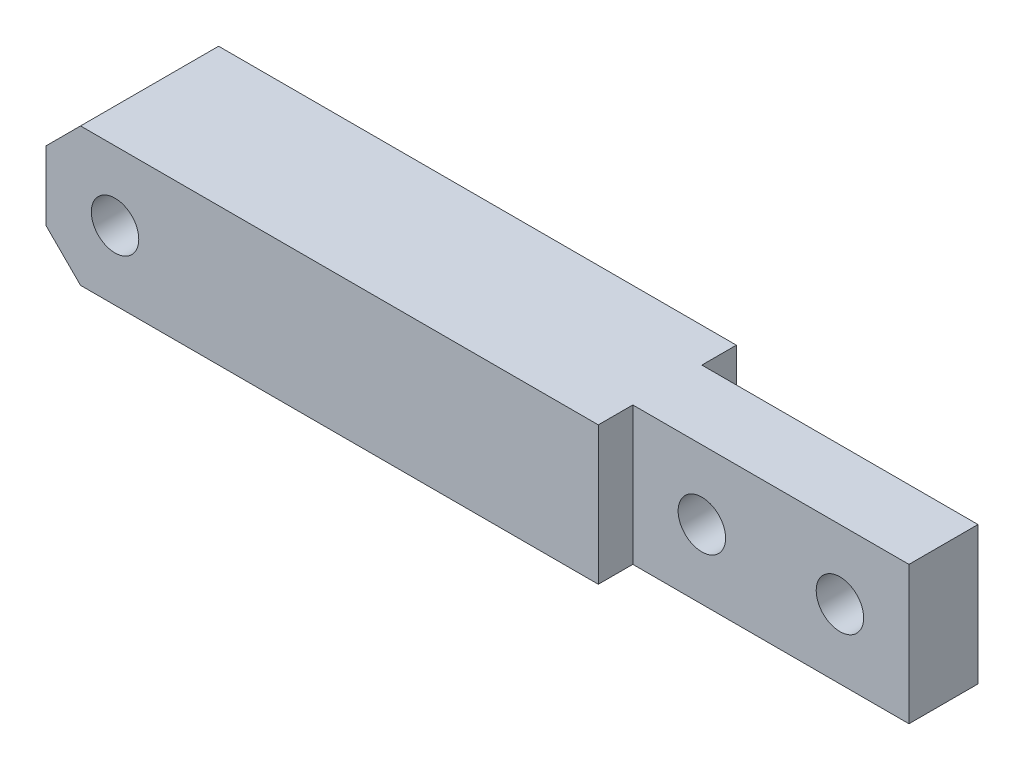
ISO-10303-21;
HEADER;
FILE_DESCRIPTION(('STEP AP214'),'2;1');
FILE_NAME('part.step','',(''),(''),'','','');
FILE_SCHEMA(('AUTOMOTIVE_DESIGN { 1 0 10303 214 1 1 1 1 }'));
ENDSEC;
DATA;
#1=APPLICATION_CONTEXT('core data for automotive mechanical design processes');
#2=APPLICATION_PROTOCOL_DEFINITION('international standard','automotive_design',2000,#1);
#3=PRODUCT_CONTEXT('',#1,'mechanical');
#4=PRODUCT('Part','Part','',(#3));
#5=PRODUCT_RELATED_PRODUCT_CATEGORY('part','',(#4));
#6=PRODUCT_DEFINITION_FORMATION('','',#4);
#7=PRODUCT_DEFINITION_CONTEXT('part definition',#1,'design');
#8=PRODUCT_DEFINITION('design','',#6,#7);
#9=PRODUCT_DEFINITION_SHAPE('','',#8);
#10=(LENGTH_UNIT() NAMED_UNIT(*) SI_UNIT(.MILLI.,.METRE.));
#11=(NAMED_UNIT(*) PLANE_ANGLE_UNIT() SI_UNIT($,.RADIAN.));
#12=(NAMED_UNIT(*) SI_UNIT($,.STERADIAN.) SOLID_ANGLE_UNIT());
#13=UNCERTAINTY_MEASURE_WITH_UNIT(LENGTH_MEASURE(1.E-05),#10,'distance_accuracy_value','');
#14=(GEOMETRIC_REPRESENTATION_CONTEXT(3) GLOBAL_UNCERTAINTY_ASSIGNED_CONTEXT((#13)) GLOBAL_UNIT_ASSIGNED_CONTEXT((#10,
#11,#12)) REPRESENTATION_CONTEXT('',''));
#15=CARTESIAN_POINT('',(0.,0.,0.));
#16=DIRECTION('',(0.,0.,1.));
#17=DIRECTION('',(1.,0.,0.));
#18=AXIS2_PLACEMENT_3D('',#15,#16,#17);
#19=CARTESIAN_POINT('',(0.,6.35,-12.7));
#20=DIRECTION('',(1.,0.,0.));
#21=DIRECTION('',(0.,0.,-1.));
#22=AXIS2_PLACEMENT_3D('',#19,#20,#21);
#23=PLANE('',#22);
#24=DIRECTION('',(0.,-1.,0.));
#25=VECTOR('',#24,1.);
#26=CARTESIAN_POINT('',(0.,6.35,-12.7));
#27=LINE('',#26,#25);
#28=CARTESIAN_POINT('',(0.,3.17499999999999,-12.7));
#29=VERTEX_POINT('',#28);
#30=CARTESIAN_POINT('',(0.,-3.175,-12.7));
#31=VERTEX_POINT('',#30);
#32=EDGE_CURVE('E167',#29,#31,#27,.T.);
#33=ORIENTED_EDGE('',*,*,#32,.T.);
#34=DIRECTION('',(0.,0.,1.));
#35=VECTOR('',#34,1.);
#36=CARTESIAN_POINT('',(0.,-3.175,-12.7));
#37=LINE('',#36,#35);
#38=CARTESIAN_POINT('',(0.,-3.175,0.));
#39=VERTEX_POINT('',#38);
#40=EDGE_CURVE('E224',#31,#39,#37,.T.);
#41=ORIENTED_EDGE('',*,*,#40,.T.);
#42=DIRECTION('',(0.,-1.,0.));
#43=VECTOR('',#42,1.);
#44=CARTESIAN_POINT('',(0.,6.35,0.));
#45=LINE('',#44,#43);
#46=CARTESIAN_POINT('',(0.,3.17499999999999,0.));
#47=VERTEX_POINT('',#46);
#48=EDGE_CURVE('E142',#47,#39,#45,.T.);
#49=ORIENTED_EDGE('',*,*,#48,.F.);
#50=DIRECTION('',(0.,0.,-1.));
#51=VECTOR('',#50,1.);
#52=CARTESIAN_POINT('',(0.,3.17499999999999,-12.7));
#53=LINE('',#52,#51);
#54=EDGE_CURVE('E211',#47,#29,#53,.T.);
#55=ORIENTED_EDGE('',*,*,#54,.T.);
#56=EDGE_LOOP('',(#33,#41,#49,#55));
#57=FACE_BOUND('',#56,.T.);
#58=ADVANCED_FACE('F41',(#57),#23,.F.);
#59=CARTESIAN_POINT('',(0.,6.35,0.));
#60=DIRECTION('',(0.,0.,-1.));
#61=DIRECTION('',(-1.,0.,0.));
#62=AXIS2_PLACEMENT_3D('',#59,#60,#61);
#63=PLANE('',#62);
#64=CARTESIAN_POINT('',(6.35,0.,0.));
#65=DIRECTION('',(0.,0.,-1.));
#66=DIRECTION('',(-1.,0.,0.));
#67=AXIS2_PLACEMENT_3D('',#64,#65,#66);
#68=CIRCLE('',#67,2.1828125);
#69=CARTESIAN_POINT('',(4.1671875,0.,0.));
#70=VERTEX_POINT('',#69);
#71=EDGE_CURVE('E217',#70,#70,#68,.T.);
#72=ORIENTED_EDGE('',*,*,#71,.T.);
#73=EDGE_LOOP('',(#72));
#74=FACE_BOUND('',#73,.T.);
#75=ORIENTED_EDGE('',*,*,#48,.T.);
#76=DIRECTION('',(-0.707106781186549,0.707106781186546,0.));
#77=VECTOR('',#76,1.);
#78=CARTESIAN_POINT('',(0.,-3.175,0.));
#79=LINE('',#78,#77);
#80=CARTESIAN_POINT('',(3.17500000000002,-6.35,0.));
#81=VERTEX_POINT('',#80);
#82=EDGE_CURVE('E231',#39,#81,#79,.F.);
#83=ORIENTED_EDGE('',*,*,#82,.T.);
#84=DIRECTION('',(1.,0.,0.));
#85=VECTOR('',#84,1.);
#86=CARTESIAN_POINT('',(0.,-6.35,0.));
#87=LINE('',#86,#85);
#88=CARTESIAN_POINT('',(50.8,-6.35,0.));
#89=VERTEX_POINT('',#88);
#90=EDGE_CURVE('E138',#81,#89,#87,.T.);
#91=ORIENTED_EDGE('',*,*,#90,.T.);
#92=DIRECTION('',(0.,-1.,0.));
#93=VECTOR('',#92,1.);
#94=CARTESIAN_POINT('',(50.8,6.35,0.));
#95=LINE('',#94,#93);
#96=CARTESIAN_POINT('',(50.8,6.35,0.));
#97=VERTEX_POINT('',#96);
#98=EDGE_CURVE('E135',#97,#89,#95,.T.);
#99=ORIENTED_EDGE('',*,*,#98,.F.);
#100=DIRECTION('',(1.,0.,0.));
#101=VECTOR('',#100,1.);
#102=CARTESIAN_POINT('',(0.,6.35,0.));
#103=LINE('',#102,#101);
#104=CARTESIAN_POINT('',(3.175,6.35,0.));
#105=VERTEX_POINT('',#104);
#106=EDGE_CURVE('E123',#105,#97,#103,.T.);
#107=ORIENTED_EDGE('',*,*,#106,.F.);
#108=DIRECTION('',(-0.707106781186547,-0.707106781186548,0.));
#109=VECTOR('',#108,1.);
#110=CARTESIAN_POINT('',(3.175,6.35,0.));
#111=LINE('',#110,#109);
#112=EDGE_CURVE('E228',#105,#47,#111,.T.);
#113=ORIENTED_EDGE('',*,*,#112,.T.);
#114=EDGE_LOOP('',(#75,#83,#91,#99,#107,#113));
#115=FACE_BOUND('',#114,.T.);
#116=ADVANCED_FACE('F137',(#74,#115),#63,.F.);
#117=CARTESIAN_POINT('',(50.8,6.35,0.));
#118=DIRECTION('',(-1.,0.,0.));
#119=DIRECTION('',(0.,0.,1.));
#120=AXIS2_PLACEMENT_3D('',#117,#118,#119);
#121=PLANE('',#120);
#122=DIRECTION('',(0.,0.,-1.));
#123=VECTOR('',#122,1.);
#124=CARTESIAN_POINT('',(50.8,-6.35,0.));
#125=LINE('',#124,#123);
#126=CARTESIAN_POINT('',(50.8,-6.35,-3.175));
#127=VERTEX_POINT('',#126);
#128=EDGE_CURVE('E170',#89,#127,#125,.T.);
#129=ORIENTED_EDGE('',*,*,#128,.T.);
#130=DIRECTION('',(0.,-1.,0.));
#131=VECTOR('',#130,1.);
#132=CARTESIAN_POINT('',(50.8,6.35,-3.175));
#133=LINE('',#132,#131);
#134=CARTESIAN_POINT('',(50.8,6.35,-3.175));
#135=VERTEX_POINT('',#134);
#136=EDGE_CURVE('E143',#135,#127,#133,.T.);
#137=ORIENTED_EDGE('',*,*,#136,.F.);
#138=DIRECTION('',(0.,0.,-1.));
#139=VECTOR('',#138,1.);
#140=CARTESIAN_POINT('',(50.8,6.35,0.));
#141=LINE('',#140,#139);
#142=EDGE_CURVE('E127',#97,#135,#141,.T.);
#143=ORIENTED_EDGE('',*,*,#142,.F.);
#144=ORIENTED_EDGE('',*,*,#98,.T.);
#145=EDGE_LOOP('',(#129,#137,#143,#144));
#146=FACE_BOUND('',#145,.T.);
#147=ADVANCED_FACE('F145',(#146),#121,.F.);
#148=CARTESIAN_POINT('',(50.8,6.35,-3.175));
#149=DIRECTION('',(0.,0.,-1.));
#150=DIRECTION('',(-1.,0.,0.));
#151=AXIS2_PLACEMENT_3D('',#148,#149,#150);
#152=PLANE('',#151);
#153=CARTESIAN_POINT('',(57.15,0.,-3.175));
#154=DIRECTION('',(0.,0.,-1.));
#155=DIRECTION('',(-1.,0.,0.));
#156=AXIS2_PLACEMENT_3D('',#153,#154,#155);
#157=CIRCLE('',#156,2.1828125);
#158=CARTESIAN_POINT('',(54.9671875,0.,-3.175));
#159=VERTEX_POINT('',#158);
#160=EDGE_CURVE('E171',#159,#159,#157,.T.);
#161=ORIENTED_EDGE('',*,*,#160,.T.);
#162=EDGE_LOOP('',(#161));
#163=FACE_BOUND('',#162,.T.);
#164=CARTESIAN_POINT('',(69.85,0.,-3.175));
#165=DIRECTION('',(0.,0.,-1.));
#166=DIRECTION('',(-1.,0.,0.));
#167=AXIS2_PLACEMENT_3D('',#164,#165,#166);
#168=CIRCLE('',#167,2.1828125);
#169=CARTESIAN_POINT('',(67.6671875,0.,-3.175));
#170=VERTEX_POINT('',#169);
#171=EDGE_CURVE('E216',#170,#170,#168,.T.);
#172=ORIENTED_EDGE('',*,*,#171,.T.);
#173=EDGE_LOOP('',(#172));
#174=FACE_BOUND('',#173,.T.);
#175=DIRECTION('',(1.,0.,0.));
#176=VECTOR('',#175,1.);
#177=CARTESIAN_POINT('',(50.8,-6.35,-3.175));
#178=LINE('',#177,#176);
#179=CARTESIAN_POINT('',(76.2,-6.35,-3.175));
#180=VERTEX_POINT('',#179);
#181=EDGE_CURVE('E174',#127,#180,#178,.T.);
#182=ORIENTED_EDGE('',*,*,#181,.T.);
#183=DIRECTION('',(0.,-1.,0.));
#184=VECTOR('',#183,1.);
#185=CARTESIAN_POINT('',(76.2,6.35,-3.175));
#186=LINE('',#185,#184);
#187=CARTESIAN_POINT('',(76.2,6.35,-3.175));
#188=VERTEX_POINT('',#187);
#189=EDGE_CURVE('E203',#188,#180,#186,.T.);
#190=ORIENTED_EDGE('',*,*,#189,.F.);
#191=DIRECTION('',(1.,0.,0.));
#192=VECTOR('',#191,1.);
#193=CARTESIAN_POINT('',(50.8,6.35,-3.175));
#194=LINE('',#193,#192);
#195=EDGE_CURVE('E149',#135,#188,#194,.T.);
#196=ORIENTED_EDGE('',*,*,#195,.F.);
#197=ORIENTED_EDGE('',*,*,#136,.T.);
#198=EDGE_LOOP('',(#182,#190,#196,#197));
#199=FACE_BOUND('',#198,.T.);
#200=ADVANCED_FACE('F250',(#163,#174,#199),#152,.F.);
#201=CARTESIAN_POINT('',(76.2,6.35,-3.175));
#202=DIRECTION('',(-1.,0.,0.));
#203=DIRECTION('',(0.,0.,1.));
#204=AXIS2_PLACEMENT_3D('',#201,#202,#203);
#205=PLANE('',#204);
#206=DIRECTION('',(0.,0.,-1.));
#207=VECTOR('',#206,1.);
#208=CARTESIAN_POINT('',(76.2,-6.35,-3.175));
#209=LINE('',#208,#207);
#210=CARTESIAN_POINT('',(76.2,-6.35,-9.525));
#211=VERTEX_POINT('',#210);
#212=EDGE_CURVE('E177',#180,#211,#209,.T.);
#213=ORIENTED_EDGE('',*,*,#212,.T.);
#214=DIRECTION('',(0.,-1.,0.));
#215=VECTOR('',#214,1.);
#216=CARTESIAN_POINT('',(76.2,6.35,-9.525));
#217=LINE('',#216,#215);
#218=CARTESIAN_POINT('',(76.2,6.35,-9.525));
#219=VERTEX_POINT('',#218);
#220=EDGE_CURVE('E199',#219,#211,#217,.T.);
#221=ORIENTED_EDGE('',*,*,#220,.F.);
#222=DIRECTION('',(0.,0.,-1.));
#223=VECTOR('',#222,1.);
#224=CARTESIAN_POINT('',(76.2,6.35,-3.175));
#225=LINE('',#224,#223);
#226=EDGE_CURVE('E152',#188,#219,#225,.T.);
#227=ORIENTED_EDGE('',*,*,#226,.F.);
#228=ORIENTED_EDGE('',*,*,#189,.T.);
#229=EDGE_LOOP('',(#213,#221,#227,#228));
#230=FACE_BOUND('',#229,.T.);
#231=ADVANCED_FACE('F257',(#230),#205,.F.);
#232=CARTESIAN_POINT('',(76.2,6.35,-9.525));
#233=DIRECTION('',(0.,0.,1.));
#234=DIRECTION('',(1.,0.,0.));
#235=AXIS2_PLACEMENT_3D('',#232,#233,#234);
#236=PLANE('',#235);
#237=CARTESIAN_POINT('',(57.15,0.,-9.525));
#238=DIRECTION('',(0.,0.,1.));
#239=DIRECTION('',(1.,0.,0.));
#240=AXIS2_PLACEMENT_3D('',#237,#238,#239);
#241=CIRCLE('',#240,2.1828125);
#242=CARTESIAN_POINT('',(59.3328125,0.,-9.525));
#243=VERTEX_POINT('',#242);
#244=EDGE_CURVE('E218',#243,#243,#241,.T.);
#245=ORIENTED_EDGE('',*,*,#244,.T.);
#246=EDGE_LOOP('',(#245));
#247=FACE_BOUND('',#246,.T.);
#248=CARTESIAN_POINT('',(69.85,0.,-9.525));
#249=DIRECTION('',(0.,0.,1.));
#250=DIRECTION('',(1.,0.,0.));
#251=AXIS2_PLACEMENT_3D('',#248,#249,#250);
#252=CIRCLE('',#251,2.1828125);
#253=CARTESIAN_POINT('',(72.0328125,0.,-9.525));
#254=VERTEX_POINT('',#253);
#255=EDGE_CURVE('E212',#254,#254,#252,.T.);
#256=ORIENTED_EDGE('',*,*,#255,.T.);
#257=EDGE_LOOP('',(#256));
#258=FACE_BOUND('',#257,.T.);
#259=DIRECTION('',(-1.,0.,0.));
#260=VECTOR('',#259,1.);
#261=CARTESIAN_POINT('',(76.2,-6.35,-9.525));
#262=LINE('',#261,#260);
#263=CARTESIAN_POINT('',(50.8,-6.35,-9.52499999999999));
#264=VERTEX_POINT('',#263);
#265=EDGE_CURVE('E180',#211,#264,#262,.T.);
#266=ORIENTED_EDGE('',*,*,#265,.T.);
#267=DIRECTION('',(0.,-1.,0.));
#268=VECTOR('',#267,1.);
#269=CARTESIAN_POINT('',(50.8,6.35,-9.52499999999999));
#270=LINE('',#269,#268);
#271=CARTESIAN_POINT('',(50.8,6.35,-9.52499999999999));
#272=VERTEX_POINT('',#271);
#273=EDGE_CURVE('E195',#272,#264,#270,.T.);
#274=ORIENTED_EDGE('',*,*,#273,.F.);
#275=DIRECTION('',(-1.,0.,0.));
#276=VECTOR('',#275,1.);
#277=CARTESIAN_POINT('',(76.2,6.35,-9.525));
#278=LINE('',#277,#276);
#279=EDGE_CURVE('E158',#219,#272,#278,.T.);
#280=ORIENTED_EDGE('',*,*,#279,.F.);
#281=ORIENTED_EDGE('',*,*,#220,.T.);
#282=EDGE_LOOP('',(#266,#274,#280,#281));
#283=FACE_BOUND('',#282,.T.);
#284=ADVANCED_FACE('F260',(#247,#258,#283),#236,.F.);
#285=CARTESIAN_POINT('',(50.8,6.35,-9.52499999999999));
#286=DIRECTION('',(-1.,0.,0.));
#287=DIRECTION('',(0.,0.,1.));
#288=AXIS2_PLACEMENT_3D('',#285,#286,#287);
#289=PLANE('',#288);
#290=DIRECTION('',(0.,0.,-1.));
#291=VECTOR('',#290,1.);
#292=CARTESIAN_POINT('',(50.8,-6.35,-9.52499999999999));
#293=LINE('',#292,#291);
#294=CARTESIAN_POINT('',(50.8,-6.35,-12.7));
#295=VERTEX_POINT('',#294);
#296=EDGE_CURVE('E183',#264,#295,#293,.T.);
#297=ORIENTED_EDGE('',*,*,#296,.T.);
#298=DIRECTION('',(0.,-1.,0.));
#299=VECTOR('',#298,1.);
#300=CARTESIAN_POINT('',(50.8,6.35,-12.7));
#301=LINE('',#300,#299);
#302=CARTESIAN_POINT('',(50.8,6.35,-12.7));
#303=VERTEX_POINT('',#302);
#304=EDGE_CURVE('E191',#303,#295,#301,.T.);
#305=ORIENTED_EDGE('',*,*,#304,.F.);
#306=DIRECTION('',(0.,0.,-1.));
#307=VECTOR('',#306,1.);
#308=CARTESIAN_POINT('',(50.8,6.35,-9.52499999999999));
#309=LINE('',#308,#307);
#310=EDGE_CURVE('E161',#272,#303,#309,.T.);
#311=ORIENTED_EDGE('',*,*,#310,.F.);
#312=ORIENTED_EDGE('',*,*,#273,.T.);
#313=EDGE_LOOP('',(#297,#305,#311,#312));
#314=FACE_BOUND('',#313,.T.);
#315=ADVANCED_FACE('F265',(#314),#289,.F.);
#316=CARTESIAN_POINT('',(50.8,6.35,-12.7));
#317=DIRECTION('',(0.,0.,1.));
#318=DIRECTION('',(1.,0.,0.));
#319=AXIS2_PLACEMENT_3D('',#316,#317,#318);
#320=PLANE('',#319);
#321=CARTESIAN_POINT('',(6.35,0.,-12.7));
#322=DIRECTION('',(0.,0.,1.));
#323=DIRECTION('',(1.,0.,0.));
#324=AXIS2_PLACEMENT_3D('',#321,#322,#323);
#325=CIRCLE('',#324,2.1828125);
#326=CARTESIAN_POINT('',(8.5328125,0.,-12.7));
#327=VERTEX_POINT('',#326);
#328=EDGE_CURVE('E319',#327,#327,#325,.T.);
#329=ORIENTED_EDGE('',*,*,#328,.T.);
#330=EDGE_LOOP('',(#329));
#331=FACE_BOUND('',#330,.T.);
#332=DIRECTION('',(-1.,0.,0.));
#333=VECTOR('',#332,1.);
#334=CARTESIAN_POINT('',(50.8,-6.35,-12.7));
#335=LINE('',#334,#333);
#336=CARTESIAN_POINT('',(3.17500000000003,-6.35,-12.7));
#337=VERTEX_POINT('',#336);
#338=EDGE_CURVE('E132',#295,#337,#335,.T.);
#339=ORIENTED_EDGE('',*,*,#338,.T.);
#340=DIRECTION('',(0.707106781186549,-0.707106781186546,0.));
#341=VECTOR('',#340,1.);
#342=CARTESIAN_POINT('',(0.,-3.175,-12.7));
#343=LINE('',#342,#341);
#344=EDGE_CURVE('E51',#337,#31,#343,.F.);
#345=ORIENTED_EDGE('',*,*,#344,.T.);
#346=ORIENTED_EDGE('',*,*,#32,.F.);
#347=DIRECTION('',(0.707106781186547,0.707106781186548,0.));
#348=VECTOR('',#347,1.);
#349=CARTESIAN_POINT('',(3.175,6.35,-12.7));
#350=LINE('',#349,#348);
#351=CARTESIAN_POINT('',(3.17500000000002,6.35,-12.7));
#352=VERTEX_POINT('',#351);
#353=EDGE_CURVE('E58',#29,#352,#350,.T.);
#354=ORIENTED_EDGE('',*,*,#353,.T.);
#355=DIRECTION('',(-1.,0.,0.));
#356=VECTOR('',#355,1.);
#357=CARTESIAN_POINT('',(50.8,6.35,-12.7));
#358=LINE('',#357,#356);
#359=EDGE_CURVE('E164',#303,#352,#358,.T.);
#360=ORIENTED_EDGE('',*,*,#359,.F.);
#361=ORIENTED_EDGE('',*,*,#304,.T.);
#362=EDGE_LOOP('',(#339,#345,#346,#354,#360,#361));
#363=FACE_BOUND('',#362,.T.);
#364=ADVANCED_FACE('F239',(#331,#363),#320,.F.);
#365=CARTESIAN_POINT('',(0.,6.35,0.));
#366=DIRECTION('',(0.,1.,0.));
#367=DIRECTION('',(0.,0.,1.));
#368=AXIS2_PLACEMENT_3D('',#365,#366,#367);
#369=PLANE('',#368);
#370=ORIENTED_EDGE('',*,*,#359,.T.);
#371=DIRECTION('',(0.,0.,1.));
#372=VECTOR('',#371,1.);
#373=CARTESIAN_POINT('',(3.175,6.35,0.));
#374=LINE('',#373,#372);
#375=EDGE_CURVE('E11',#352,#105,#374,.T.);
#376=ORIENTED_EDGE('',*,*,#375,.T.);
#377=ORIENTED_EDGE('',*,*,#106,.T.);
#378=ORIENTED_EDGE('',*,*,#142,.T.);
#379=ORIENTED_EDGE('',*,*,#195,.T.);
#380=ORIENTED_EDGE('',*,*,#226,.T.);
#381=ORIENTED_EDGE('',*,*,#279,.T.);
#382=ORIENTED_EDGE('',*,*,#310,.T.);
#383=EDGE_LOOP('',(#370,#376,#377,#378,#379,#380,#381,#382));
#384=FACE_BOUND('',#383,.T.);
#385=ADVANCED_FACE('F125',(#384),#369,.T.);
#386=CARTESIAN_POINT('',(0.,-6.35,0.));
#387=DIRECTION('',(0.,1.,0.));
#388=DIRECTION('',(0.,0.,1.));
#389=AXIS2_PLACEMENT_3D('',#386,#387,#388);
#390=PLANE('',#389);
#391=ORIENTED_EDGE('',*,*,#90,.F.);
#392=DIRECTION('',(0.,0.,-1.));
#393=VECTOR('',#392,1.);
#394=CARTESIAN_POINT('',(3.17500000000002,-6.35,0.));
#395=LINE('',#394,#393);
#396=EDGE_CURVE('E66',#81,#337,#395,.T.);
#397=ORIENTED_EDGE('',*,*,#396,.T.);
#398=ORIENTED_EDGE('',*,*,#338,.F.);
#399=ORIENTED_EDGE('',*,*,#296,.F.);
#400=ORIENTED_EDGE('',*,*,#265,.F.);
#401=ORIENTED_EDGE('',*,*,#212,.F.);
#402=ORIENTED_EDGE('',*,*,#181,.F.);
#403=ORIENTED_EDGE('',*,*,#128,.F.);
#404=EDGE_LOOP('',(#391,#397,#398,#399,#400,#401,#402,#403));
#405=FACE_BOUND('',#404,.T.);
#406=ADVANCED_FACE('F246',(#405),#390,.F.);
#407=CARTESIAN_POINT('',(6.35,0.,-12.7));
#408=DIRECTION('',(0.,0.,1.));
#409=DIRECTION('',(1.,0.,0.));
#410=AXIS2_PLACEMENT_3D('',#407,#408,#409);
#411=CYLINDRICAL_SURFACE('',#410,2.1828125);
#412=ORIENTED_EDGE('',*,*,#328,.F.);
#413=EDGE_LOOP('',(#412));
#414=FACE_BOUND('',#413,.T.);
#415=ORIENTED_EDGE('',*,*,#71,.F.);
#416=EDGE_LOOP('',(#415));
#417=FACE_BOUND('',#416,.T.);
#418=ADVANCED_FACE('F302',(#414,#417),#411,.F.);
#419=CARTESIAN_POINT('',(69.85,0.,-12.7));
#420=DIRECTION('',(0.,0.,1.));
#421=DIRECTION('',(1.,0.,0.));
#422=AXIS2_PLACEMENT_3D('',#419,#420,#421);
#423=CYLINDRICAL_SURFACE('',#422,2.1828125);
#424=ORIENTED_EDGE('',*,*,#255,.F.);
#425=EDGE_LOOP('',(#424));
#426=FACE_BOUND('',#425,.T.);
#427=ORIENTED_EDGE('',*,*,#171,.F.);
#428=EDGE_LOOP('',(#427));
#429=FACE_BOUND('',#428,.T.);
#430=ADVANCED_FACE('F305',(#426,#429),#423,.F.);
#431=CARTESIAN_POINT('',(57.15,0.,-12.7));
#432=DIRECTION('',(0.,0.,1.));
#433=DIRECTION('',(1.,0.,0.));
#434=AXIS2_PLACEMENT_3D('',#431,#432,#433);
#435=CYLINDRICAL_SURFACE('',#434,2.1828125);
#436=ORIENTED_EDGE('',*,*,#244,.F.);
#437=EDGE_LOOP('',(#436));
#438=FACE_BOUND('',#437,.T.);
#439=ORIENTED_EDGE('',*,*,#160,.F.);
#440=EDGE_LOOP('',(#439));
#441=FACE_BOUND('',#440,.T.);
#442=ADVANCED_FACE('F271',(#438,#441),#435,.F.);
#443=CARTESIAN_POINT('',(0.,-3.175,-12.7));
#444=DIRECTION('',(0.707106781186546,0.707106781186549,0.));
#445=DIRECTION('',(0.,0.,1.));
#446=AXIS2_PLACEMENT_3D('',#443,#444,#445);
#447=PLANE('',#446);
#448=ORIENTED_EDGE('',*,*,#344,.F.);
#449=ORIENTED_EDGE('',*,*,#396,.F.);
#450=ORIENTED_EDGE('',*,*,#82,.F.);
#451=ORIENTED_EDGE('',*,*,#40,.F.);
#452=EDGE_LOOP('',(#448,#449,#450,#451));
#453=FACE_BOUND('',#452,.T.);
#454=ADVANCED_FACE('F245',(#453),#447,.F.);
#455=CARTESIAN_POINT('',(3.175,6.35,0.));
#456=DIRECTION('',(-0.707106781186548,0.707106781186547,0.));
#457=DIRECTION('',(0.,0.,-1.));
#458=AXIS2_PLACEMENT_3D('',#455,#456,#457);
#459=PLANE('',#458);
#460=ORIENTED_EDGE('',*,*,#353,.F.);
#461=ORIENTED_EDGE('',*,*,#54,.F.);
#462=ORIENTED_EDGE('',*,*,#112,.F.);
#463=ORIENTED_EDGE('',*,*,#375,.F.);
#464=EDGE_LOOP('',(#460,#461,#462,#463));
#465=FACE_BOUND('',#464,.T.);
#466=ADVANCED_FACE('F44',(#465),#459,.T.);
#467=CLOSED_SHELL('',(#58,#116,#147,#200,#231,#284,#315,#364,#385,#406,#418,#430,#442,#454,#466));
#468=MANIFOLD_SOLID_BREP('B2',#467);
#469=ADVANCED_BREP_SHAPE_REPRESENTATION('',(#18,#468),#14);
#470=SHAPE_DEFINITION_REPRESENTATION(#9,#469);
ENDSEC;
END-ISO-10303-21;
